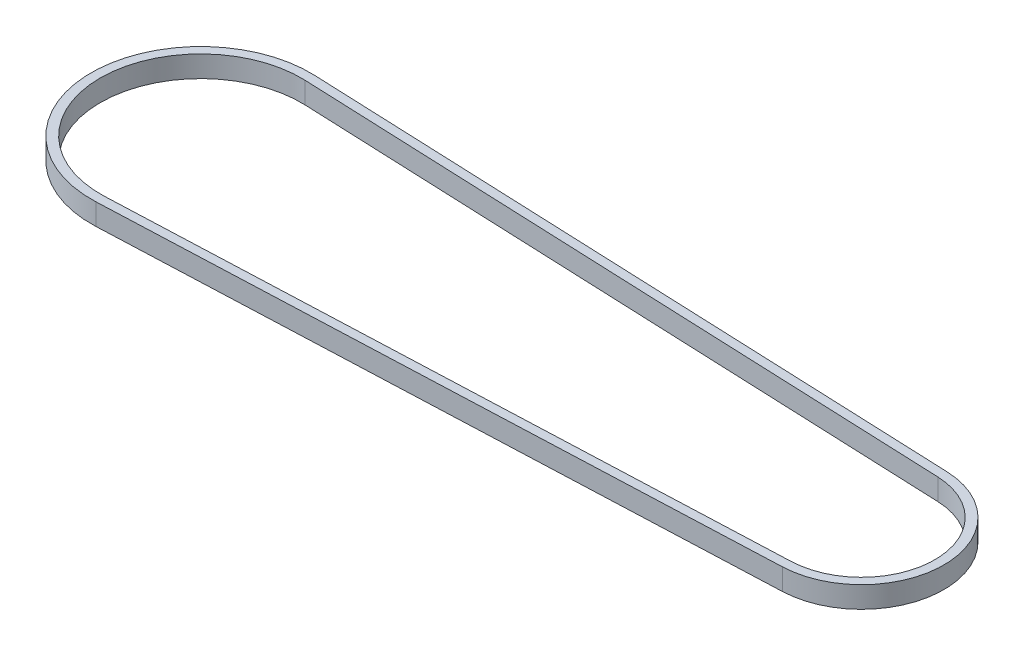
ISO-10303-21;
HEADER;
FILE_DESCRIPTION(('STEP AP214'),'2;1');
FILE_NAME('part.step','',(''),(''),'','','');
FILE_SCHEMA(('AUTOMOTIVE_DESIGN { 1 0 10303 214 1 1 1 1 }'));
ENDSEC;
DATA;
#1=APPLICATION_CONTEXT('core data for automotive mechanical design processes');
#2=APPLICATION_PROTOCOL_DEFINITION('international standard','automotive_design',2000,#1);
#3=PRODUCT_CONTEXT('',#1,'mechanical');
#4=PRODUCT('Part','Part','',(#3));
#5=PRODUCT_RELATED_PRODUCT_CATEGORY('part','',(#4));
#6=PRODUCT_DEFINITION_FORMATION('','',#4);
#7=PRODUCT_DEFINITION_CONTEXT('part definition',#1,'design');
#8=PRODUCT_DEFINITION('design','',#6,#7);
#9=PRODUCT_DEFINITION_SHAPE('','',#8);
#10=(LENGTH_UNIT() NAMED_UNIT(*) SI_UNIT(.MILLI.,.METRE.));
#11=(NAMED_UNIT(*) PLANE_ANGLE_UNIT() SI_UNIT($,.RADIAN.));
#12=(NAMED_UNIT(*) SI_UNIT($,.STERADIAN.) SOLID_ANGLE_UNIT());
#13=UNCERTAINTY_MEASURE_WITH_UNIT(LENGTH_MEASURE(1.E-05),#10,'distance_accuracy_value','');
#14=(GEOMETRIC_REPRESENTATION_CONTEXT(3) GLOBAL_UNCERTAINTY_ASSIGNED_CONTEXT((#13)) GLOBAL_UNIT_ASSIGNED_CONTEXT((#10,
#11,#12)) REPRESENTATION_CONTEXT('',''));
#15=CARTESIAN_POINT('',(0.,0.,0.));
#16=DIRECTION('',(0.,0.,1.));
#17=DIRECTION('',(1.,0.,0.));
#18=AXIS2_PLACEMENT_3D('',#15,#16,#17);
#19=CARTESIAN_POINT('',(185.42,6.,0.));
#20=DIRECTION('',(0.,1.,0.));
#21=DIRECTION('',(0.,0.,1.));
#22=AXIS2_PLACEMENT_3D('',#19,#20,#21);
#23=PLANE('',#22);
#24=CARTESIAN_POINT('',(185.42,6.,0.));
#25=DIRECTION('',(0.,1.,0.));
#26=DIRECTION('',(0.,0.,1.));
#27=AXIS2_PLACEMENT_3D('',#24,#25,#26);
#28=CIRCLE('',#27,23.114);
#29=CARTESIAN_POINT('',(186.369890410959,6.,23.0944734559411));
#30=VERTEX_POINT('',#29);
#31=CARTESIAN_POINT('',(186.369890410959,6.,-23.0944734559411));
#32=VERTEX_POINT('',#31);
#33=EDGE_CURVE('E165',#30,#32,#28,.T.);
#34=ORIENTED_EDGE('',*,*,#33,.T.);
#35=DIRECTION('',(-0.999155207058108,0.,-0.0410958904109589));
#36=VECTOR('',#35,1.);
#37=CARTESIAN_POINT('',(186.369890410959,6.,-23.0944734559411));
#38=LINE('',#37,#36);
#39=CARTESIAN_POINT('',(1.26304109589041,6.,-30.7080361337239));
#40=VERTEX_POINT('',#39);
#41=EDGE_CURVE('E169',#32,#40,#38,.T.);
#42=ORIENTED_EDGE('',*,*,#41,.T.);
#43=CARTESIAN_POINT('',(0.,6.,0.));
#44=DIRECTION('',(0.,1.,0.));
#45=DIRECTION('',(0.,0.,1.));
#46=AXIS2_PLACEMENT_3D('',#43,#44,#45);
#47=CIRCLE('',#46,30.734);
#48=CARTESIAN_POINT('',(1.26304109589041,6.,30.7080361337239));
#49=VERTEX_POINT('',#48);
#50=EDGE_CURVE('E172',#40,#49,#47,.T.);
#51=ORIENTED_EDGE('',*,*,#50,.T.);
#52=DIRECTION('',(0.999155207058108,0.,-0.0410958904109588));
#53=VECTOR('',#52,1.);
#54=CARTESIAN_POINT('',(186.369890410959,6.,23.0944734559411));
#55=LINE('',#54,#53);
#56=EDGE_CURVE('E175',#49,#30,#55,.T.);
#57=ORIENTED_EDGE('',*,*,#56,.T.);
#58=EDGE_LOOP('',(#34,#42,#51,#57));
#59=FACE_BOUND('',#58,.T.);
#60=DIRECTION('',(-0.999155207058108,0.,-0.0410958904109589));
#61=VECTOR('',#60,1.);
#62=CARTESIAN_POINT('',(186.265506849315,6.,-20.5566192300135));
#63=LINE('',#62,#61);
#64=CARTESIAN_POINT('',(186.265506849315,6.,-20.5566192300135));
#65=VERTEX_POINT('',#64);
#66=CARTESIAN_POINT('',(1.15865753424658,6.,-28.1701819077963));
#67=VERTEX_POINT('',#66);
#68=EDGE_CURVE('E126',#65,#67,#63,.T.);
#69=ORIENTED_EDGE('',*,*,#68,.F.);
#70=CARTESIAN_POINT('',(185.42,6.,0.));
#71=DIRECTION('',(0.,1.,0.));
#72=DIRECTION('',(0.,0.,1.));
#73=AXIS2_PLACEMENT_3D('',#70,#71,#72);
#74=CIRCLE('',#73,20.574);
#75=CARTESIAN_POINT('',(186.265506849315,6.,20.5566192300135));
#76=VERTEX_POINT('',#75);
#77=EDGE_CURVE('E117',#76,#65,#74,.T.);
#78=ORIENTED_EDGE('',*,*,#77,.F.);
#79=DIRECTION('',(0.999155207058108,0.,-0.0410958904109588));
#80=VECTOR('',#79,1.);
#81=CARTESIAN_POINT('',(186.265506849315,6.,20.5566192300135));
#82=LINE('',#81,#80);
#83=CARTESIAN_POINT('',(1.15865753424657,6.,28.1701819077963));
#84=VERTEX_POINT('',#83);
#85=EDGE_CURVE('E144',#84,#76,#82,.T.);
#86=ORIENTED_EDGE('',*,*,#85,.F.);
#87=CARTESIAN_POINT('',(0.,6.,0.));
#88=DIRECTION('',(0.,1.,0.));
#89=DIRECTION('',(0.,0.,1.));
#90=AXIS2_PLACEMENT_3D('',#87,#88,#89);
#91=CIRCLE('',#90,28.194);
#92=EDGE_CURVE('E139',#67,#84,#91,.T.);
#93=ORIENTED_EDGE('',*,*,#92,.F.);
#94=EDGE_LOOP('',(#69,#78,#86,#93));
#95=FACE_BOUND('',#94,.T.);
#96=ADVANCED_FACE('F39',(#59,#95),#23,.T.);
#97=CARTESIAN_POINT('',(185.42,0.,0.));
#98=DIRECTION('',(0.,1.,0.));
#99=DIRECTION('',(0.,0.,1.));
#100=AXIS2_PLACEMENT_3D('',#97,#98,#99);
#101=PLANE('',#100);
#102=CARTESIAN_POINT('',(185.42,0.,0.));
#103=DIRECTION('',(0.,1.,0.));
#104=DIRECTION('',(0.,0.,1.));
#105=AXIS2_PLACEMENT_3D('',#102,#103,#104);
#106=CIRCLE('',#105,23.114);
#107=CARTESIAN_POINT('',(186.369890410959,0.,23.0944734559411));
#108=VERTEX_POINT('',#107);
#109=CARTESIAN_POINT('',(186.369890410959,0.,-23.0944734559411));
#110=VERTEX_POINT('',#109);
#111=EDGE_CURVE('E135',#108,#110,#106,.T.);
#112=ORIENTED_EDGE('',*,*,#111,.F.);
#113=DIRECTION('',(0.999155207058108,0.,-0.0410958904109588));
#114=VECTOR('',#113,1.);
#115=CARTESIAN_POINT('',(186.369890410959,0.,23.0944734559411));
#116=LINE('',#115,#114);
#117=CARTESIAN_POINT('',(1.26304109589041,0.,30.7080361337239));
#118=VERTEX_POINT('',#117);
#119=EDGE_CURVE('E170',#118,#108,#116,.T.);
#120=ORIENTED_EDGE('',*,*,#119,.F.);
#121=CARTESIAN_POINT('',(0.,0.,0.));
#122=DIRECTION('',(0.,1.,0.));
#123=DIRECTION('',(0.,0.,1.));
#124=AXIS2_PLACEMENT_3D('',#121,#122,#123);
#125=CIRCLE('',#124,30.734);
#126=CARTESIAN_POINT('',(1.26304109589041,0.,-30.7080361337239));
#127=VERTEX_POINT('',#126);
#128=EDGE_CURVE('E185',#127,#118,#125,.T.);
#129=ORIENTED_EDGE('',*,*,#128,.F.);
#130=DIRECTION('',(-0.999155207058108,0.,-0.0410958904109589));
#131=VECTOR('',#130,1.);
#132=CARTESIAN_POINT('',(186.369890410959,0.,-23.0944734559411));
#133=LINE('',#132,#131);
#134=EDGE_CURVE('E182',#110,#127,#133,.T.);
#135=ORIENTED_EDGE('',*,*,#134,.F.);
#136=EDGE_LOOP('',(#112,#120,#129,#135));
#137=FACE_BOUND('',#136,.T.);
#138=CARTESIAN_POINT('',(185.42,0.,0.));
#139=DIRECTION('',(0.,1.,0.));
#140=DIRECTION('',(0.,0.,1.));
#141=AXIS2_PLACEMENT_3D('',#138,#139,#140);
#142=CIRCLE('',#141,20.574);
#143=CARTESIAN_POINT('',(186.265506849315,0.,20.5566192300135));
#144=VERTEX_POINT('',#143);
#145=CARTESIAN_POINT('',(186.265506849315,0.,-20.5566192300135));
#146=VERTEX_POINT('',#145);
#147=EDGE_CURVE('E68',#144,#146,#142,.T.);
#148=ORIENTED_EDGE('',*,*,#147,.T.);
#149=DIRECTION('',(-0.999155207058108,0.,-0.0410958904109589));
#150=VECTOR('',#149,1.);
#151=CARTESIAN_POINT('',(186.265506849315,0.,-20.5566192300135));
#152=LINE('',#151,#150);
#153=CARTESIAN_POINT('',(1.15865753424658,0.,-28.1701819077963));
#154=VERTEX_POINT('',#153);
#155=EDGE_CURVE('E133',#146,#154,#152,.T.);
#156=ORIENTED_EDGE('',*,*,#155,.T.);
#157=CARTESIAN_POINT('',(0.,0.,0.));
#158=DIRECTION('',(0.,1.,0.));
#159=DIRECTION('',(0.,0.,1.));
#160=AXIS2_PLACEMENT_3D('',#157,#158,#159);
#161=CIRCLE('',#160,28.194);
#162=CARTESIAN_POINT('',(1.15865753424657,0.,28.1701819077963));
#163=VERTEX_POINT('',#162);
#164=EDGE_CURVE('E153',#154,#163,#161,.T.);
#165=ORIENTED_EDGE('',*,*,#164,.T.);
#166=DIRECTION('',(0.999155207058108,0.,-0.0410958904109588));
#167=VECTOR('',#166,1.);
#168=CARTESIAN_POINT('',(186.265506849315,0.,20.5566192300135));
#169=LINE('',#168,#167);
#170=EDGE_CURVE('E127',#163,#144,#169,.T.);
#171=ORIENTED_EDGE('',*,*,#170,.T.);
#172=EDGE_LOOP('',(#148,#156,#165,#171));
#173=FACE_BOUND('',#172,.T.);
#174=ADVANCED_FACE('F207',(#137,#173),#101,.F.);
#175=CARTESIAN_POINT('',(185.42,6.,0.));
#176=DIRECTION('',(0.,-1.,0.));
#177=DIRECTION('',(0.,0.,-1.));
#178=AXIS2_PLACEMENT_3D('',#175,#176,#177);
#179=CYLINDRICAL_SURFACE('',#178,23.114);
#180=ORIENTED_EDGE('',*,*,#111,.T.);
#181=DIRECTION('',(0.,-1.,0.));
#182=VECTOR('',#181,1.);
#183=CARTESIAN_POINT('',(186.369890410959,6.,-23.0944734559411));
#184=LINE('',#183,#182);
#185=EDGE_CURVE('E11',#32,#110,#184,.T.);
#186=ORIENTED_EDGE('',*,*,#185,.F.);
#187=ORIENTED_EDGE('',*,*,#33,.F.);
#188=DIRECTION('',(0.,-1.,0.));
#189=VECTOR('',#188,1.);
#190=CARTESIAN_POINT('',(186.369890410959,6.,23.0944734559411));
#191=LINE('',#190,#189);
#192=EDGE_CURVE('E178',#30,#108,#191,.T.);
#193=ORIENTED_EDGE('',*,*,#192,.T.);
#194=EDGE_LOOP('',(#180,#186,#187,#193));
#195=FACE_BOUND('',#194,.T.);
#196=ADVANCED_FACE('F41',(#195),#179,.T.);
#197=CARTESIAN_POINT('',(186.369890410959,6.,-23.0944734559411));
#198=DIRECTION('',(-0.0410958904109589,0.,0.999155207058108));
#199=DIRECTION('',(0.999155207058108,0.,0.0410958904109589));
#200=AXIS2_PLACEMENT_3D('',#197,#198,#199);
#201=PLANE('',#200);
#202=ORIENTED_EDGE('',*,*,#134,.T.);
#203=DIRECTION('',(0.,-1.,0.));
#204=VECTOR('',#203,1.);
#205=CARTESIAN_POINT('',(1.26304109589041,6.,-30.7080361337239));
#206=LINE('',#205,#204);
#207=EDGE_CURVE('E48',#40,#127,#206,.T.);
#208=ORIENTED_EDGE('',*,*,#207,.F.);
#209=ORIENTED_EDGE('',*,*,#41,.F.);
#210=ORIENTED_EDGE('',*,*,#185,.T.);
#211=EDGE_LOOP('',(#202,#208,#209,#210));
#212=FACE_BOUND('',#211,.T.);
#213=ADVANCED_FACE('F217',(#212),#201,.F.);
#214=CARTESIAN_POINT('',(0.,6.,0.));
#215=DIRECTION('',(0.,-1.,0.));
#216=DIRECTION('',(0.,0.,-1.));
#217=AXIS2_PLACEMENT_3D('',#214,#215,#216);
#218=CYLINDRICAL_SURFACE('',#217,30.734);
#219=ORIENTED_EDGE('',*,*,#128,.T.);
#220=DIRECTION('',(0.,-1.,0.));
#221=VECTOR('',#220,1.);
#222=CARTESIAN_POINT('',(1.26304109589041,6.,30.7080361337239));
#223=LINE('',#222,#221);
#224=EDGE_CURVE('E193',#49,#118,#223,.T.);
#225=ORIENTED_EDGE('',*,*,#224,.F.);
#226=ORIENTED_EDGE('',*,*,#50,.F.);
#227=ORIENTED_EDGE('',*,*,#207,.T.);
#228=EDGE_LOOP('',(#219,#225,#226,#227));
#229=FACE_BOUND('',#228,.T.);
#230=ADVANCED_FACE('F201',(#229),#218,.T.);
#231=CARTESIAN_POINT('',(186.369890410959,6.,23.0944734559411));
#232=DIRECTION('',(-0.0410958904109589,0.,-0.999155207058108));
#233=DIRECTION('',(-0.999155207058108,0.,0.0410958904109589));
#234=AXIS2_PLACEMENT_3D('',#231,#232,#233);
#235=PLANE('',#234);
#236=ORIENTED_EDGE('',*,*,#119,.T.);
#237=ORIENTED_EDGE('',*,*,#192,.F.);
#238=ORIENTED_EDGE('',*,*,#56,.F.);
#239=ORIENTED_EDGE('',*,*,#224,.T.);
#240=EDGE_LOOP('',(#236,#237,#238,#239));
#241=FACE_BOUND('',#240,.T.);
#242=ADVANCED_FACE('F211',(#241),#235,.F.);
#243=CARTESIAN_POINT('',(185.42,6.,0.));
#244=DIRECTION('',(0.,-1.,0.));
#245=DIRECTION('',(0.,0.,-1.));
#246=AXIS2_PLACEMENT_3D('',#243,#244,#245);
#247=CYLINDRICAL_SURFACE('',#246,20.574);
#248=ORIENTED_EDGE('',*,*,#147,.F.);
#249=DIRECTION('',(0.,-1.,0.));
#250=VECTOR('',#249,1.);
#251=CARTESIAN_POINT('',(186.265506849315,6.,20.5566192300135));
#252=LINE('',#251,#250);
#253=EDGE_CURVE('E121',#76,#144,#252,.T.);
#254=ORIENTED_EDGE('',*,*,#253,.F.);
#255=ORIENTED_EDGE('',*,*,#77,.T.);
#256=DIRECTION('',(0.,-1.,0.));
#257=VECTOR('',#256,1.);
#258=CARTESIAN_POINT('',(186.265506849315,6.,-20.5566192300135));
#259=LINE('',#258,#257);
#260=EDGE_CURVE('E120',#65,#146,#259,.T.);
#261=ORIENTED_EDGE('',*,*,#260,.T.);
#262=EDGE_LOOP('',(#248,#254,#255,#261));
#263=FACE_BOUND('',#262,.T.);
#264=ADVANCED_FACE('F119',(#263),#247,.F.);
#265=CARTESIAN_POINT('',(186.265506849315,6.,-20.5566192300135));
#266=DIRECTION('',(-0.0410958904109589,0.,0.999155207058108));
#267=DIRECTION('',(0.999155207058108,0.,0.0410958904109589));
#268=AXIS2_PLACEMENT_3D('',#265,#266,#267);
#269=PLANE('',#268);
#270=ORIENTED_EDGE('',*,*,#155,.F.);
#271=ORIENTED_EDGE('',*,*,#260,.F.);
#272=ORIENTED_EDGE('',*,*,#68,.T.);
#273=DIRECTION('',(0.,-1.,0.));
#274=VECTOR('',#273,1.);
#275=CARTESIAN_POINT('',(1.15865753424658,6.,-28.1701819077963));
#276=LINE('',#275,#274);
#277=EDGE_CURVE('E136',#67,#154,#276,.T.);
#278=ORIENTED_EDGE('',*,*,#277,.T.);
#279=EDGE_LOOP('',(#270,#271,#272,#278));
#280=FACE_BOUND('',#279,.T.);
#281=ADVANCED_FACE('F130',(#280),#269,.T.);
#282=CARTESIAN_POINT('',(0.,6.,0.));
#283=DIRECTION('',(0.,-1.,0.));
#284=DIRECTION('',(0.,0.,-1.));
#285=AXIS2_PLACEMENT_3D('',#282,#283,#284);
#286=CYLINDRICAL_SURFACE('',#285,28.194);
#287=ORIENTED_EDGE('',*,*,#164,.F.);
#288=ORIENTED_EDGE('',*,*,#277,.F.);
#289=ORIENTED_EDGE('',*,*,#92,.T.);
#290=DIRECTION('',(0.,-1.,0.));
#291=VECTOR('',#290,1.);
#292=CARTESIAN_POINT('',(1.15865753424657,6.,28.1701819077963));
#293=LINE('',#292,#291);
#294=EDGE_CURVE('E58',#84,#163,#293,.T.);
#295=ORIENTED_EDGE('',*,*,#294,.T.);
#296=EDGE_LOOP('',(#287,#288,#289,#295));
#297=FACE_BOUND('',#296,.T.);
#298=ADVANCED_FACE('F240',(#297),#286,.F.);
#299=CARTESIAN_POINT('',(186.265506849315,6.,20.5566192300135));
#300=DIRECTION('',(-0.0410958904109589,0.,-0.999155207058108));
#301=DIRECTION('',(-0.999155207058108,0.,0.0410958904109589));
#302=AXIS2_PLACEMENT_3D('',#299,#300,#301);
#303=PLANE('',#302);
#304=ORIENTED_EDGE('',*,*,#170,.F.);
#305=ORIENTED_EDGE('',*,*,#294,.F.);
#306=ORIENTED_EDGE('',*,*,#85,.T.);
#307=ORIENTED_EDGE('',*,*,#253,.T.);
#308=EDGE_LOOP('',(#304,#305,#306,#307));
#309=FACE_BOUND('',#308,.T.);
#310=ADVANCED_FACE('F244',(#309),#303,.T.);
#311=CLOSED_SHELL('',(#96,#174,#196,#213,#230,#242,#264,#281,#298,#310));
#312=MANIFOLD_SOLID_BREP('B2',#311);
#313=ADVANCED_BREP_SHAPE_REPRESENTATION('',(#18,#312),#14);
#314=SHAPE_DEFINITION_REPRESENTATION(#9,#313);
ENDSEC;
END-ISO-10303-21;
